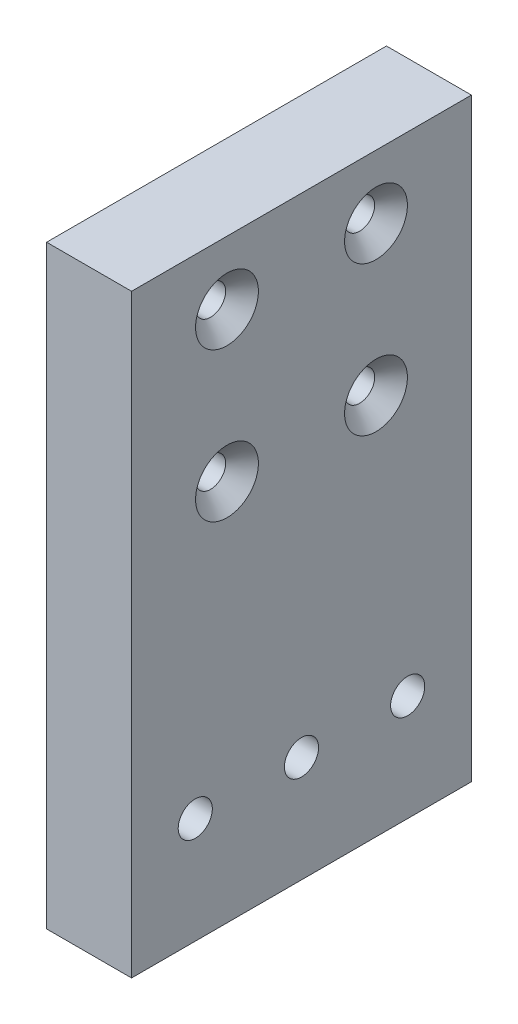
ISO-10303-21;
HEADER;
FILE_DESCRIPTION(('STEP AP214'),'2;1');
FILE_NAME('part.step','',(''),(''),'','','');
FILE_SCHEMA(('AUTOMOTIVE_DESIGN { 1 0 10303 214 1 1 1 1 }'));
ENDSEC;
DATA;
#1=APPLICATION_CONTEXT('core data for automotive mechanical design processes');
#2=APPLICATION_PROTOCOL_DEFINITION('international standard','automotive_design',2000,#1);
#3=PRODUCT_CONTEXT('',#1,'mechanical');
#4=PRODUCT('Part','Part','',(#3));
#5=PRODUCT_RELATED_PRODUCT_CATEGORY('part','',(#4));
#6=PRODUCT_DEFINITION_FORMATION('','',#4);
#7=PRODUCT_DEFINITION_CONTEXT('part definition',#1,'design');
#8=PRODUCT_DEFINITION('design','',#6,#7);
#9=PRODUCT_DEFINITION_SHAPE('','',#8);
#10=(LENGTH_UNIT() NAMED_UNIT(*) SI_UNIT(.MILLI.,.METRE.));
#11=(NAMED_UNIT(*) PLANE_ANGLE_UNIT() SI_UNIT($,.RADIAN.));
#12=(NAMED_UNIT(*) SI_UNIT($,.STERADIAN.) SOLID_ANGLE_UNIT());
#13=UNCERTAINTY_MEASURE_WITH_UNIT(LENGTH_MEASURE(1.E-05),#10,'distance_accuracy_value','');
#14=(GEOMETRIC_REPRESENTATION_CONTEXT(3) GLOBAL_UNCERTAINTY_ASSIGNED_CONTEXT((#13)) GLOBAL_UNIT_ASSIGNED_CONTEXT((#10,
#11,#12)) REPRESENTATION_CONTEXT('',''));
#15=CARTESIAN_POINT('',(0.,0.,0.));
#16=DIRECTION('',(0.,0.,1.));
#17=DIRECTION('',(1.,0.,0.));
#18=AXIS2_PLACEMENT_3D('',#15,#16,#17);
#19=CARTESIAN_POINT('',(12.7,-44.45,-25.4));
#20=DIRECTION('',(0.,0.,1.));
#21=DIRECTION('',(1.,0.,0.));
#22=AXIS2_PLACEMENT_3D('',#19,#20,#21);
#23=PLANE('',#22);
#24=DIRECTION('',(0.,1.,0.));
#25=VECTOR('',#24,1.);
#26=CARTESIAN_POINT('',(0.,-44.45,-25.4));
#27=LINE('',#26,#25);
#28=CARTESIAN_POINT('',(0.,-44.45,-25.4));
#29=VERTEX_POINT('',#28);
#30=CARTESIAN_POINT('',(0.,44.45,-25.4));
#31=VERTEX_POINT('',#30);
#32=EDGE_CURVE('E95',#29,#31,#27,.T.);
#33=ORIENTED_EDGE('',*,*,#32,.T.);
#34=DIRECTION('',(-1.,0.,0.));
#35=VECTOR('',#34,1.);
#36=CARTESIAN_POINT('',(12.7,44.45,-25.4));
#37=LINE('',#36,#35);
#38=CARTESIAN_POINT('',(12.7,44.45,-25.4));
#39=VERTEX_POINT('',#38);
#40=EDGE_CURVE('E11',#39,#31,#37,.T.);
#41=ORIENTED_EDGE('',*,*,#40,.F.);
#42=DIRECTION('',(0.,1.,0.));
#43=VECTOR('',#42,1.);
#44=CARTESIAN_POINT('',(12.7,-44.45,-25.4));
#45=LINE('',#44,#43);
#46=CARTESIAN_POINT('',(12.7,-44.45,-25.4));
#47=VERTEX_POINT('',#46);
#48=EDGE_CURVE('E83',#47,#39,#45,.T.);
#49=ORIENTED_EDGE('',*,*,#48,.F.);
#50=DIRECTION('',(-1.,0.,0.));
#51=VECTOR('',#50,1.);
#52=CARTESIAN_POINT('',(12.7,-44.45,-25.4));
#53=LINE('',#52,#51);
#54=EDGE_CURVE('E91',#47,#29,#53,.T.);
#55=ORIENTED_EDGE('',*,*,#54,.T.);
#56=EDGE_LOOP('',(#33,#41,#49,#55));
#57=FACE_BOUND('',#56,.T.);
#58=ADVANCED_FACE('F32',(#57),#23,.F.);
#59=CARTESIAN_POINT('',(12.7,44.45,25.4));
#60=DIRECTION('',(0.,-1.,0.));
#61=DIRECTION('',(0.,0.,-1.));
#62=AXIS2_PLACEMENT_3D('',#59,#60,#61);
#63=PLANE('',#62);
#64=DIRECTION('',(0.,0.,1.));
#65=VECTOR('',#64,1.);
#66=CARTESIAN_POINT('',(0.,44.45,25.4));
#67=LINE('',#66,#65);
#68=CARTESIAN_POINT('',(0.,44.45,25.4));
#69=VERTEX_POINT('',#68);
#70=EDGE_CURVE('E87',#31,#69,#67,.T.);
#71=ORIENTED_EDGE('',*,*,#70,.T.);
#72=DIRECTION('',(-1.,0.,0.));
#73=VECTOR('',#72,1.);
#74=CARTESIAN_POINT('',(12.7,44.45,25.4));
#75=LINE('',#74,#73);
#76=CARTESIAN_POINT('',(12.7,44.45,25.4));
#77=VERTEX_POINT('',#76);
#78=EDGE_CURVE('E40',#77,#69,#75,.T.);
#79=ORIENTED_EDGE('',*,*,#78,.F.);
#80=DIRECTION('',(0.,0.,1.));
#81=VECTOR('',#80,1.);
#82=CARTESIAN_POINT('',(12.7,44.45,25.4));
#83=LINE('',#82,#81);
#84=EDGE_CURVE('E78',#39,#77,#83,.T.);
#85=ORIENTED_EDGE('',*,*,#84,.F.);
#86=ORIENTED_EDGE('',*,*,#40,.T.);
#87=EDGE_LOOP('',(#71,#79,#85,#86));
#88=FACE_BOUND('',#87,.T.);
#89=ADVANCED_FACE('F86',(#88),#63,.F.);
#90=CARTESIAN_POINT('',(12.7,-44.45,25.4));
#91=DIRECTION('',(0.,0.,-1.));
#92=DIRECTION('',(-1.,0.,0.));
#93=AXIS2_PLACEMENT_3D('',#90,#91,#92);
#94=PLANE('',#93);
#95=DIRECTION('',(0.,-1.,0.));
#96=VECTOR('',#95,1.);
#97=CARTESIAN_POINT('',(0.,-44.45,25.4));
#98=LINE('',#97,#96);
#99=CARTESIAN_POINT('',(0.,-44.45,25.4));
#100=VERTEX_POINT('',#99);
#101=EDGE_CURVE('E65',#69,#100,#98,.T.);
#102=ORIENTED_EDGE('',*,*,#101,.T.);
#103=DIRECTION('',(-1.,0.,0.));
#104=VECTOR('',#103,1.);
#105=CARTESIAN_POINT('',(12.7,-44.45,25.4));
#106=LINE('',#105,#104);
#107=CARTESIAN_POINT('',(12.7,-44.45,25.4));
#108=VERTEX_POINT('',#107);
#109=EDGE_CURVE('E88',#108,#100,#106,.T.);
#110=ORIENTED_EDGE('',*,*,#109,.F.);
#111=DIRECTION('',(0.,-1.,0.));
#112=VECTOR('',#111,1.);
#113=CARTESIAN_POINT('',(12.7,-44.45,25.4));
#114=LINE('',#113,#112);
#115=EDGE_CURVE('E81',#77,#108,#114,.T.);
#116=ORIENTED_EDGE('',*,*,#115,.F.);
#117=ORIENTED_EDGE('',*,*,#78,.T.);
#118=EDGE_LOOP('',(#102,#110,#116,#117));
#119=FACE_BOUND('',#118,.T.);
#120=ADVANCED_FACE('F89',(#119),#94,.F.);
#121=CARTESIAN_POINT('',(12.7,-44.45,25.4));
#122=DIRECTION('',(0.,1.,0.));
#123=DIRECTION('',(0.,0.,1.));
#124=AXIS2_PLACEMENT_3D('',#121,#122,#123);
#125=PLANE('',#124);
#126=DIRECTION('',(0.,0.,-1.));
#127=VECTOR('',#126,1.);
#128=CARTESIAN_POINT('',(0.,-44.45,25.4));
#129=LINE('',#128,#127);
#130=EDGE_CURVE('E71',#100,#29,#129,.T.);
#131=ORIENTED_EDGE('',*,*,#130,.T.);
#132=ORIENTED_EDGE('',*,*,#54,.F.);
#133=DIRECTION('',(0.,0.,-1.));
#134=VECTOR('',#133,1.);
#135=CARTESIAN_POINT('',(12.7,-44.45,25.4));
#136=LINE('',#135,#134);
#137=EDGE_CURVE('E48',#108,#47,#136,.T.);
#138=ORIENTED_EDGE('',*,*,#137,.F.);
#139=ORIENTED_EDGE('',*,*,#109,.T.);
#140=EDGE_LOOP('',(#131,#132,#138,#139));
#141=FACE_BOUND('',#140,.T.);
#142=ADVANCED_FACE('F103',(#141),#125,.F.);
#143=CARTESIAN_POINT('',(12.7,0.,0.));
#144=DIRECTION('',(-1.,0.,0.));
#145=DIRECTION('',(0.,0.,1.));
#146=AXIS2_PLACEMENT_3D('',#143,#144,#145);
#147=PLANE('',#146);
#148=CARTESIAN_POINT('',(12.7,-28.575,-15.875));
#149=DIRECTION('',(-1.,0.,0.));
#150=DIRECTION('',(0.,0.,1.));
#151=AXIS2_PLACEMENT_3D('',#148,#149,#150);
#152=CIRCLE('',#151,2.5527);
#153=CARTESIAN_POINT('',(12.7,-28.575,-13.3223));
#154=VERTEX_POINT('',#153);
#155=EDGE_CURVE('E168',#154,#154,#152,.T.);
#156=ORIENTED_EDGE('',*,*,#155,.T.);
#157=EDGE_LOOP('',(#156));
#158=FACE_BOUND('',#157,.T.);
#159=CARTESIAN_POINT('',(12.7,-28.575,0.));
#160=DIRECTION('',(-1.,0.,0.));
#161=DIRECTION('',(0.,0.,1.));
#162=AXIS2_PLACEMENT_3D('',#159,#160,#161);
#163=CIRCLE('',#162,2.5527);
#164=CARTESIAN_POINT('',(12.7,-28.575,2.5527));
#165=VERTEX_POINT('',#164);
#166=EDGE_CURVE('E156',#165,#165,#163,.T.);
#167=ORIENTED_EDGE('',*,*,#166,.T.);
#168=EDGE_LOOP('',(#167));
#169=FACE_BOUND('',#168,.T.);
#170=CARTESIAN_POINT('',(12.7,-28.575,15.875));
#171=DIRECTION('',(-1.,0.,0.));
#172=DIRECTION('',(0.,0.,1.));
#173=AXIS2_PLACEMENT_3D('',#170,#171,#172);
#174=CIRCLE('',#173,2.5527);
#175=CARTESIAN_POINT('',(12.7,-28.575,18.4277));
#176=VERTEX_POINT('',#175);
#177=EDGE_CURVE('E144',#176,#176,#174,.T.);
#178=ORIENTED_EDGE('',*,*,#177,.T.);
#179=EDGE_LOOP('',(#178));
#180=FACE_BOUND('',#179,.T.);
#181=CARTESIAN_POINT('',(12.7,34.9738636073762,-11.1369318036881));
#182=DIRECTION('',(1.,0.,0.));
#183=DIRECTION('',(0.,0.,-1.));
#184=AXIS2_PLACEMENT_3D('',#181,#182,#183);
#185=CIRCLE('',#184,4.7);
#186=CARTESIAN_POINT('',(12.7,34.9738636073762,-15.8369318036881));
#187=VERTEX_POINT('',#186);
#188=EDGE_CURVE('E141',#187,#187,#185,.T.);
#189=ORIENTED_EDGE('',*,*,#188,.F.);
#190=EDGE_LOOP('',(#189));
#191=FACE_BOUND('',#190,.T.);
#192=CARTESIAN_POINT('',(12.7,34.9738636073762,11.1369318036881));
#193=DIRECTION('',(1.,0.,0.));
#194=DIRECTION('',(0.,0.,-1.));
#195=AXIS2_PLACEMENT_3D('',#192,#193,#194);
#196=CIRCLE('',#195,4.7);
#197=CARTESIAN_POINT('',(12.7,34.9738636073762,6.43693180368812));
#198=VERTEX_POINT('',#197);
#199=EDGE_CURVE('E132',#198,#198,#196,.T.);
#200=ORIENTED_EDGE('',*,*,#199,.F.);
#201=EDGE_LOOP('',(#200));
#202=FACE_BOUND('',#201,.T.);
#203=CARTESIAN_POINT('',(12.7,12.7,11.1369318036881));
#204=DIRECTION('',(1.,0.,0.));
#205=DIRECTION('',(0.,0.,-1.));
#206=AXIS2_PLACEMENT_3D('',#203,#204,#205);
#207=CIRCLE('',#206,4.7);
#208=CARTESIAN_POINT('',(12.7,12.7,6.43693180368812));
#209=VERTEX_POINT('',#208);
#210=EDGE_CURVE('E123',#209,#209,#207,.T.);
#211=ORIENTED_EDGE('',*,*,#210,.F.);
#212=EDGE_LOOP('',(#211));
#213=FACE_BOUND('',#212,.T.);
#214=CARTESIAN_POINT('',(12.7,12.7,-11.1369318036881));
#215=DIRECTION('',(1.,0.,0.));
#216=DIRECTION('',(0.,0.,-1.));
#217=AXIS2_PLACEMENT_3D('',#214,#215,#216);
#218=CIRCLE('',#217,4.7);
#219=CARTESIAN_POINT('',(12.7,12.7,-15.8369318036881));
#220=VERTEX_POINT('',#219);
#221=EDGE_CURVE('E114',#220,#220,#218,.T.);
#222=ORIENTED_EDGE('',*,*,#221,.F.);
#223=EDGE_LOOP('',(#222));
#224=FACE_BOUND('',#223,.T.);
#225=ORIENTED_EDGE('',*,*,#48,.T.);
#226=ORIENTED_EDGE('',*,*,#84,.T.);
#227=ORIENTED_EDGE('',*,*,#115,.T.);
#228=ORIENTED_EDGE('',*,*,#137,.T.);
#229=EDGE_LOOP('',(#225,#226,#227,#228));
#230=FACE_BOUND('',#229,.T.);
#231=ADVANCED_FACE('F79',(#158,#169,#180,#191,#202,#213,#224,#230),#147,.F.);
#232=CARTESIAN_POINT('',(0.,0.,0.));
#233=DIRECTION('',(-1.,0.,0.));
#234=DIRECTION('',(0.,0.,1.));
#235=AXIS2_PLACEMENT_3D('',#232,#233,#234);
#236=PLANE('',#235);
#237=CARTESIAN_POINT('',(0.,-28.575,-15.875));
#238=DIRECTION('',(-1.,0.,0.));
#239=DIRECTION('',(0.,0.,1.));
#240=AXIS2_PLACEMENT_3D('',#237,#238,#239);
#241=CIRCLE('',#240,4.7625);
#242=CARTESIAN_POINT('',(0.,-28.575,-11.1125));
#243=VERTEX_POINT('',#242);
#244=EDGE_CURVE('E177',#243,#243,#241,.T.);
#245=ORIENTED_EDGE('',*,*,#244,.F.);
#246=EDGE_LOOP('',(#245));
#247=FACE_BOUND('',#246,.T.);
#248=CARTESIAN_POINT('',(0.,-28.575,0.));
#249=DIRECTION('',(-1.,0.,0.));
#250=DIRECTION('',(0.,0.,1.));
#251=AXIS2_PLACEMENT_3D('',#248,#249,#250);
#252=CIRCLE('',#251,4.7625);
#253=CARTESIAN_POINT('',(0.,-28.575,4.7625));
#254=VERTEX_POINT('',#253);
#255=EDGE_CURVE('E165',#254,#254,#252,.T.);
#256=ORIENTED_EDGE('',*,*,#255,.F.);
#257=EDGE_LOOP('',(#256));
#258=FACE_BOUND('',#257,.T.);
#259=CARTESIAN_POINT('',(0.,-28.575,15.875));
#260=DIRECTION('',(-1.,0.,0.));
#261=DIRECTION('',(0.,0.,1.));
#262=AXIS2_PLACEMENT_3D('',#259,#260,#261);
#263=CIRCLE('',#262,4.7625);
#264=CARTESIAN_POINT('',(0.,-28.575,20.6375));
#265=VERTEX_POINT('',#264);
#266=EDGE_CURVE('E153',#265,#265,#263,.T.);
#267=ORIENTED_EDGE('',*,*,#266,.F.);
#268=EDGE_LOOP('',(#267));
#269=FACE_BOUND('',#268,.T.);
#270=CARTESIAN_POINT('',(0.,34.9738636073762,-11.1369318036881));
#271=DIRECTION('',(1.,0.,0.));
#272=DIRECTION('',(0.,0.,-1.));
#273=AXIS2_PLACEMENT_3D('',#270,#271,#272);
#274=CIRCLE('',#273,2.25);
#275=CARTESIAN_POINT('',(0.,34.9738636073762,-13.3869318036881));
#276=VERTEX_POINT('',#275);
#277=EDGE_CURVE('E135',#276,#276,#274,.T.);
#278=ORIENTED_EDGE('',*,*,#277,.T.);
#279=EDGE_LOOP('',(#278));
#280=FACE_BOUND('',#279,.T.);
#281=CARTESIAN_POINT('',(0.,34.9738636073762,11.1369318036881));
#282=DIRECTION('',(1.,0.,0.));
#283=DIRECTION('',(0.,0.,-1.));
#284=AXIS2_PLACEMENT_3D('',#281,#282,#283);
#285=CIRCLE('',#284,2.25);
#286=CARTESIAN_POINT('',(0.,34.9738636073762,8.88693180368813));
#287=VERTEX_POINT('',#286);
#288=EDGE_CURVE('E126',#287,#287,#285,.T.);
#289=ORIENTED_EDGE('',*,*,#288,.T.);
#290=EDGE_LOOP('',(#289));
#291=FACE_BOUND('',#290,.T.);
#292=CARTESIAN_POINT('',(0.,12.7,11.1369318036881));
#293=DIRECTION('',(1.,0.,0.));
#294=DIRECTION('',(0.,0.,-1.));
#295=AXIS2_PLACEMENT_3D('',#292,#293,#294);
#296=CIRCLE('',#295,2.25);
#297=CARTESIAN_POINT('',(0.,12.7,8.88693180368813));
#298=VERTEX_POINT('',#297);
#299=EDGE_CURVE('E117',#298,#298,#296,.T.);
#300=ORIENTED_EDGE('',*,*,#299,.T.);
#301=EDGE_LOOP('',(#300));
#302=FACE_BOUND('',#301,.T.);
#303=CARTESIAN_POINT('',(0.,12.7,-11.1369318036881));
#304=DIRECTION('',(1.,0.,0.));
#305=DIRECTION('',(0.,0.,-1.));
#306=AXIS2_PLACEMENT_3D('',#303,#304,#305);
#307=CIRCLE('',#306,2.25);
#308=CARTESIAN_POINT('',(0.,12.7,-13.3869318036881));
#309=VERTEX_POINT('',#308);
#310=EDGE_CURVE('E98',#309,#309,#307,.T.);
#311=ORIENTED_EDGE('',*,*,#310,.T.);
#312=EDGE_LOOP('',(#311));
#313=FACE_BOUND('',#312,.T.);
#314=ORIENTED_EDGE('',*,*,#32,.F.);
#315=ORIENTED_EDGE('',*,*,#130,.F.);
#316=ORIENTED_EDGE('',*,*,#101,.F.);
#317=ORIENTED_EDGE('',*,*,#70,.F.);
#318=EDGE_LOOP('',(#314,#315,#316,#317));
#319=FACE_BOUND('',#318,.T.);
#320=ADVANCED_FACE('F106',(#247,#258,#269,#280,#291,#302,#313,#319),#236,.T.);
#321=CARTESIAN_POINT('',(12.7,12.7,-11.1369318036881));
#322=DIRECTION('',(1.,0.,0.));
#323=DIRECTION('',(0.,0.,-1.));
#324=AXIS2_PLACEMENT_3D('',#321,#322,#323);
#325=CYLINDRICAL_SURFACE('',#324,2.25);
#326=ORIENTED_EDGE('',*,*,#310,.F.);
#327=EDGE_LOOP('',(#326));
#328=FACE_BOUND('',#327,.T.);
#329=CARTESIAN_POINT('',(10.25,12.7,-11.1369318036881));
#330=DIRECTION('',(1.,0.,0.));
#331=DIRECTION('',(0.,0.,-1.));
#332=AXIS2_PLACEMENT_3D('',#329,#330,#331);
#333=CIRCLE('',#332,2.25);
#334=CARTESIAN_POINT('',(10.25,12.7,-13.3869318036881));
#335=VERTEX_POINT('',#334);
#336=EDGE_CURVE('E111',#335,#335,#333,.T.);
#337=ORIENTED_EDGE('',*,*,#336,.T.);
#338=EDGE_LOOP('',(#337));
#339=FACE_BOUND('',#338,.T.);
#340=ADVANCED_FACE('F185',(#328,#339),#325,.F.);
#341=CARTESIAN_POINT('',(12.7,12.7,-11.1369318036881));
#342=DIRECTION('',(1.,0.,0.));
#343=DIRECTION('',(0.,0.,-1.));
#344=AXIS2_PLACEMENT_3D('',#341,#342,#343);
#345=CONICAL_SURFACE('',#344,4.7,0.785398163397448);
#346=ORIENTED_EDGE('',*,*,#336,.F.);
#347=EDGE_LOOP('',(#346));
#348=FACE_BOUND('',#347,.T.);
#349=ORIENTED_EDGE('',*,*,#221,.T.);
#350=EDGE_LOOP('',(#349));
#351=FACE_BOUND('',#350,.T.);
#352=ADVANCED_FACE('F201',(#348,#351),#345,.F.);
#353=CARTESIAN_POINT('',(12.7,12.7,11.1369318036881));
#354=DIRECTION('',(1.,0.,0.));
#355=DIRECTION('',(0.,0.,-1.));
#356=AXIS2_PLACEMENT_3D('',#353,#354,#355);
#357=CYLINDRICAL_SURFACE('',#356,2.25);
#358=ORIENTED_EDGE('',*,*,#299,.F.);
#359=EDGE_LOOP('',(#358));
#360=FACE_BOUND('',#359,.T.);
#361=CARTESIAN_POINT('',(10.25,12.7,11.1369318036881));
#362=DIRECTION('',(1.,0.,0.));
#363=DIRECTION('',(0.,0.,-1.));
#364=AXIS2_PLACEMENT_3D('',#361,#362,#363);
#365=CIRCLE('',#364,2.25);
#366=CARTESIAN_POINT('',(10.25,12.7,8.88693180368812));
#367=VERTEX_POINT('',#366);
#368=EDGE_CURVE('E120',#367,#367,#365,.T.);
#369=ORIENTED_EDGE('',*,*,#368,.T.);
#370=EDGE_LOOP('',(#369));
#371=FACE_BOUND('',#370,.T.);
#372=ADVANCED_FACE('F207',(#360,#371),#357,.F.);
#373=CARTESIAN_POINT('',(12.7,12.7,11.1369318036881));
#374=DIRECTION('',(1.,0.,0.));
#375=DIRECTION('',(0.,0.,-1.));
#376=AXIS2_PLACEMENT_3D('',#373,#374,#375);
#377=CONICAL_SURFACE('',#376,4.7,0.785398163397448);
#378=ORIENTED_EDGE('',*,*,#368,.F.);
#379=EDGE_LOOP('',(#378));
#380=FACE_BOUND('',#379,.T.);
#381=ORIENTED_EDGE('',*,*,#210,.T.);
#382=EDGE_LOOP('',(#381));
#383=FACE_BOUND('',#382,.T.);
#384=ADVANCED_FACE('F256',(#380,#383),#377,.F.);
#385=CARTESIAN_POINT('',(12.7,34.9738636073762,11.1369318036881));
#386=DIRECTION('',(1.,0.,0.));
#387=DIRECTION('',(0.,0.,-1.));
#388=AXIS2_PLACEMENT_3D('',#385,#386,#387);
#389=CYLINDRICAL_SURFACE('',#388,2.25);
#390=ORIENTED_EDGE('',*,*,#288,.F.);
#391=EDGE_LOOP('',(#390));
#392=FACE_BOUND('',#391,.T.);
#393=CARTESIAN_POINT('',(10.25,34.9738636073762,11.1369318036881));
#394=DIRECTION('',(1.,0.,0.));
#395=DIRECTION('',(0.,0.,-1.));
#396=AXIS2_PLACEMENT_3D('',#393,#394,#395);
#397=CIRCLE('',#396,2.25);
#398=CARTESIAN_POINT('',(10.25,34.9738636073762,8.88693180368813));
#399=VERTEX_POINT('',#398);
#400=EDGE_CURVE('E129',#399,#399,#397,.T.);
#401=ORIENTED_EDGE('',*,*,#400,.T.);
#402=EDGE_LOOP('',(#401));
#403=FACE_BOUND('',#402,.T.);
#404=ADVANCED_FACE('F266',(#392,#403),#389,.F.);
#405=CARTESIAN_POINT('',(12.7,34.9738636073762,11.1369318036881));
#406=DIRECTION('',(1.,0.,0.));
#407=DIRECTION('',(0.,0.,-1.));
#408=AXIS2_PLACEMENT_3D('',#405,#406,#407);
#409=CONICAL_SURFACE('',#408,4.7,0.785398163397449);
#410=ORIENTED_EDGE('',*,*,#400,.F.);
#411=EDGE_LOOP('',(#410));
#412=FACE_BOUND('',#411,.T.);
#413=ORIENTED_EDGE('',*,*,#199,.T.);
#414=EDGE_LOOP('',(#413));
#415=FACE_BOUND('',#414,.T.);
#416=ADVANCED_FACE('F276',(#412,#415),#409,.F.);
#417=CARTESIAN_POINT('',(12.7,34.9738636073762,-11.1369318036881));
#418=DIRECTION('',(1.,0.,0.));
#419=DIRECTION('',(0.,0.,-1.));
#420=AXIS2_PLACEMENT_3D('',#417,#418,#419);
#421=CYLINDRICAL_SURFACE('',#420,2.25);
#422=ORIENTED_EDGE('',*,*,#277,.F.);
#423=EDGE_LOOP('',(#422));
#424=FACE_BOUND('',#423,.T.);
#425=CARTESIAN_POINT('',(10.25,34.9738636073762,-11.1369318036881));
#426=DIRECTION('',(1.,0.,0.));
#427=DIRECTION('',(0.,0.,-1.));
#428=AXIS2_PLACEMENT_3D('',#425,#426,#427);
#429=CIRCLE('',#428,2.25);
#430=CARTESIAN_POINT('',(10.25,34.9738636073762,-13.3869318036881));
#431=VERTEX_POINT('',#430);
#432=EDGE_CURVE('E138',#431,#431,#429,.T.);
#433=ORIENTED_EDGE('',*,*,#432,.T.);
#434=EDGE_LOOP('',(#433));
#435=FACE_BOUND('',#434,.T.);
#436=ADVANCED_FACE('F286',(#424,#435),#421,.F.);
#437=CARTESIAN_POINT('',(12.7,34.9738636073762,-11.1369318036881));
#438=DIRECTION('',(1.,0.,0.));
#439=DIRECTION('',(0.,0.,-1.));
#440=AXIS2_PLACEMENT_3D('',#437,#438,#439);
#441=CONICAL_SURFACE('',#440,4.7,0.785398163397449);
#442=ORIENTED_EDGE('',*,*,#432,.F.);
#443=EDGE_LOOP('',(#442));
#444=FACE_BOUND('',#443,.T.);
#445=ORIENTED_EDGE('',*,*,#188,.T.);
#446=EDGE_LOOP('',(#445));
#447=FACE_BOUND('',#446,.T.);
#448=ADVANCED_FACE('F296',(#444,#447),#441,.F.);
#449=CARTESIAN_POINT('',(0.,-28.575,15.875));
#450=DIRECTION('',(-1.,0.,0.));
#451=DIRECTION('',(0.,0.,1.));
#452=AXIS2_PLACEMENT_3D('',#449,#450,#451);
#453=CYLINDRICAL_SURFACE('',#452,2.5527);
#454=ORIENTED_EDGE('',*,*,#177,.F.);
#455=EDGE_LOOP('',(#454));
#456=FACE_BOUND('',#455,.T.);
#457=CARTESIAN_POINT('',(4.826,-28.575,15.875));
#458=DIRECTION('',(-1.,0.,0.));
#459=DIRECTION('',(0.,0.,1.));
#460=AXIS2_PLACEMENT_3D('',#457,#458,#459);
#461=CIRCLE('',#460,2.5527);
#462=CARTESIAN_POINT('',(4.826,-28.575,18.4277));
#463=VERTEX_POINT('',#462);
#464=EDGE_CURVE('E147',#463,#463,#461,.T.);
#465=ORIENTED_EDGE('',*,*,#464,.T.);
#466=EDGE_LOOP('',(#465));
#467=FACE_BOUND('',#466,.T.);
#468=ADVANCED_FACE('F305',(#456,#467),#453,.F.);
#469=CARTESIAN_POINT('',(4.826,-26.0223,15.875));
#470=DIRECTION('',(1.,0.,0.));
#471=DIRECTION('',(0.,0.,-1.));
#472=AXIS2_PLACEMENT_3D('',#469,#470,#471);
#473=PLANE('',#472);
#474=ORIENTED_EDGE('',*,*,#464,.F.);
#475=EDGE_LOOP('',(#474));
#476=FACE_BOUND('',#475,.T.);
#477=CARTESIAN_POINT('',(4.826,-28.575,15.875));
#478=DIRECTION('',(-1.,0.,0.));
#479=DIRECTION('',(0.,0.,1.));
#480=AXIS2_PLACEMENT_3D('',#477,#478,#479);
#481=CIRCLE('',#480,4.7625);
#482=CARTESIAN_POINT('',(4.826,-28.575,20.6375));
#483=VERTEX_POINT('',#482);
#484=EDGE_CURVE('E150',#483,#483,#481,.T.);
#485=ORIENTED_EDGE('',*,*,#484,.T.);
#486=EDGE_LOOP('',(#485));
#487=FACE_BOUND('',#486,.T.);
#488=ADVANCED_FACE('F324',(#476,#487),#473,.F.);
#489=CARTESIAN_POINT('',(0.,-28.575,15.875));
#490=DIRECTION('',(-1.,0.,0.));
#491=DIRECTION('',(0.,0.,1.));
#492=AXIS2_PLACEMENT_3D('',#489,#490,#491);
#493=CYLINDRICAL_SURFACE('',#492,4.7625);
#494=ORIENTED_EDGE('',*,*,#484,.F.);
#495=EDGE_LOOP('',(#494));
#496=FACE_BOUND('',#495,.T.);
#497=ORIENTED_EDGE('',*,*,#266,.T.);
#498=EDGE_LOOP('',(#497));
#499=FACE_BOUND('',#498,.T.);
#500=ADVANCED_FACE('F334',(#496,#499),#493,.F.);
#501=CARTESIAN_POINT('',(0.,-28.575,0.));
#502=DIRECTION('',(-1.,0.,0.));
#503=DIRECTION('',(0.,0.,1.));
#504=AXIS2_PLACEMENT_3D('',#501,#502,#503);
#505=CYLINDRICAL_SURFACE('',#504,2.5527);
#506=ORIENTED_EDGE('',*,*,#166,.F.);
#507=EDGE_LOOP('',(#506));
#508=FACE_BOUND('',#507,.T.);
#509=CARTESIAN_POINT('',(4.826,-28.575,0.));
#510=DIRECTION('',(-1.,0.,0.));
#511=DIRECTION('',(0.,0.,1.));
#512=AXIS2_PLACEMENT_3D('',#509,#510,#511);
#513=CIRCLE('',#512,2.5527);
#514=CARTESIAN_POINT('',(4.826,-28.575,2.5527));
#515=VERTEX_POINT('',#514);
#516=EDGE_CURVE('E159',#515,#515,#513,.T.);
#517=ORIENTED_EDGE('',*,*,#516,.T.);
#518=EDGE_LOOP('',(#517));
#519=FACE_BOUND('',#518,.T.);
#520=ADVANCED_FACE('F344',(#508,#519),#505,.F.);
#521=CARTESIAN_POINT('',(4.826,-26.0223,0.));
#522=DIRECTION('',(1.,0.,0.));
#523=DIRECTION('',(0.,0.,-1.));
#524=AXIS2_PLACEMENT_3D('',#521,#522,#523);
#525=PLANE('',#524);
#526=ORIENTED_EDGE('',*,*,#516,.F.);
#527=EDGE_LOOP('',(#526));
#528=FACE_BOUND('',#527,.T.);
#529=CARTESIAN_POINT('',(4.826,-28.575,0.));
#530=DIRECTION('',(-1.,0.,0.));
#531=DIRECTION('',(0.,0.,1.));
#532=AXIS2_PLACEMENT_3D('',#529,#530,#531);
#533=CIRCLE('',#532,4.7625);
#534=CARTESIAN_POINT('',(4.826,-28.575,4.7625));
#535=VERTEX_POINT('',#534);
#536=EDGE_CURVE('E162',#535,#535,#533,.T.);
#537=ORIENTED_EDGE('',*,*,#536,.T.);
#538=EDGE_LOOP('',(#537));
#539=FACE_BOUND('',#538,.T.);
#540=ADVANCED_FACE('F354',(#528,#539),#525,.F.);
#541=CARTESIAN_POINT('',(0.,-28.575,0.));
#542=DIRECTION('',(-1.,0.,0.));
#543=DIRECTION('',(0.,0.,1.));
#544=AXIS2_PLACEMENT_3D('',#541,#542,#543);
#545=CYLINDRICAL_SURFACE('',#544,4.7625);
#546=ORIENTED_EDGE('',*,*,#536,.F.);
#547=EDGE_LOOP('',(#546));
#548=FACE_BOUND('',#547,.T.);
#549=ORIENTED_EDGE('',*,*,#255,.T.);
#550=EDGE_LOOP('',(#549));
#551=FACE_BOUND('',#550,.T.);
#552=ADVANCED_FACE('F364',(#548,#551),#545,.F.);
#553=CARTESIAN_POINT('',(0.,-28.575,-15.875));
#554=DIRECTION('',(-1.,0.,0.));
#555=DIRECTION('',(0.,0.,1.));
#556=AXIS2_PLACEMENT_3D('',#553,#554,#555);
#557=CYLINDRICAL_SURFACE('',#556,2.5527);
#558=ORIENTED_EDGE('',*,*,#155,.F.);
#559=EDGE_LOOP('',(#558));
#560=FACE_BOUND('',#559,.T.);
#561=CARTESIAN_POINT('',(4.826,-28.575,-15.875));
#562=DIRECTION('',(-1.,0.,0.));
#563=DIRECTION('',(0.,0.,1.));
#564=AXIS2_PLACEMENT_3D('',#561,#562,#563);
#565=CIRCLE('',#564,2.5527);
#566=CARTESIAN_POINT('',(4.826,-28.575,-13.3223));
#567=VERTEX_POINT('',#566);
#568=EDGE_CURVE('E171',#567,#567,#565,.T.);
#569=ORIENTED_EDGE('',*,*,#568,.T.);
#570=EDGE_LOOP('',(#569));
#571=FACE_BOUND('',#570,.T.);
#572=ADVANCED_FACE('F374',(#560,#571),#557,.F.);
#573=CARTESIAN_POINT('',(4.826,-26.0223,-15.875));
#574=DIRECTION('',(1.,0.,0.));
#575=DIRECTION('',(0.,0.,-1.));
#576=AXIS2_PLACEMENT_3D('',#573,#574,#575);
#577=PLANE('',#576);
#578=ORIENTED_EDGE('',*,*,#568,.F.);
#579=EDGE_LOOP('',(#578));
#580=FACE_BOUND('',#579,.T.);
#581=CARTESIAN_POINT('',(4.826,-28.575,-15.875));
#582=DIRECTION('',(-1.,0.,0.));
#583=DIRECTION('',(0.,0.,1.));
#584=AXIS2_PLACEMENT_3D('',#581,#582,#583);
#585=CIRCLE('',#584,4.7625);
#586=CARTESIAN_POINT('',(4.826,-28.575,-11.1125));
#587=VERTEX_POINT('',#586);
#588=EDGE_CURVE('E174',#587,#587,#585,.T.);
#589=ORIENTED_EDGE('',*,*,#588,.T.);
#590=EDGE_LOOP('',(#589));
#591=FACE_BOUND('',#590,.T.);
#592=ADVANCED_FACE('F384',(#580,#591),#577,.F.);
#593=CARTESIAN_POINT('',(0.,-28.575,-15.875));
#594=DIRECTION('',(-1.,0.,0.));
#595=DIRECTION('',(0.,0.,1.));
#596=AXIS2_PLACEMENT_3D('',#593,#594,#595);
#597=CYLINDRICAL_SURFACE('',#596,4.7625);
#598=ORIENTED_EDGE('',*,*,#588,.F.);
#599=EDGE_LOOP('',(#598));
#600=FACE_BOUND('',#599,.T.);
#601=ORIENTED_EDGE('',*,*,#244,.T.);
#602=EDGE_LOOP('',(#601));
#603=FACE_BOUND('',#602,.T.);
#604=ADVANCED_FACE('F181',(#600,#603),#597,.F.);
#605=CLOSED_SHELL('',(#58,#89,#120,#142,#231,#320,#340,#352,#372,#384,#404,#416,#436,#448,#468,
#488,#500,#520,#540,#552,#572,#592,#604));
#606=MANIFOLD_SOLID_BREP('B2',#605);
#607=ADVANCED_BREP_SHAPE_REPRESENTATION('',(#18,#606),#14);
#608=SHAPE_DEFINITION_REPRESENTATION(#9,#607);
ENDSEC;
END-ISO-10303-21;
